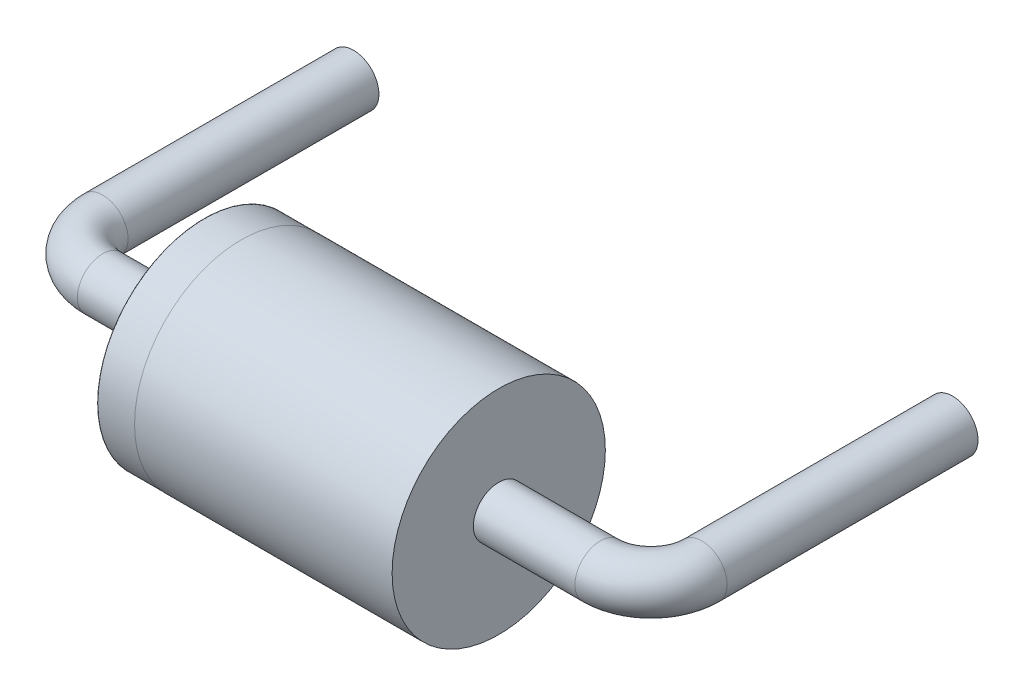
ISO-10303-21;
HEADER;
FILE_DESCRIPTION(('STEP AP214'),'2;1');
FILE_NAME('part.step','',(''),(''),'','','');
FILE_SCHEMA(('AUTOMOTIVE_DESIGN { 1 0 10303 214 1 1 1 1 }'));
ENDSEC;
DATA;
#1=APPLICATION_CONTEXT('core data for automotive mechanical design processes');
#2=APPLICATION_PROTOCOL_DEFINITION('international standard','automotive_design',2000,#1);
#3=PRODUCT_CONTEXT('',#1,'mechanical');
#4=PRODUCT('Part','Part','',(#3));
#5=PRODUCT_RELATED_PRODUCT_CATEGORY('part','',(#4));
#6=PRODUCT_DEFINITION_FORMATION('','',#4);
#7=PRODUCT_DEFINITION_CONTEXT('part definition',#1,'design');
#8=PRODUCT_DEFINITION('design','',#6,#7);
#9=PRODUCT_DEFINITION_SHAPE('','',#8);
#10=(LENGTH_UNIT() NAMED_UNIT(*) SI_UNIT(.MILLI.,.METRE.));
#11=(NAMED_UNIT(*) PLANE_ANGLE_UNIT() SI_UNIT($,.RADIAN.));
#12=(NAMED_UNIT(*) SI_UNIT($,.STERADIAN.) SOLID_ANGLE_UNIT());
#13=UNCERTAINTY_MEASURE_WITH_UNIT(LENGTH_MEASURE(1.E-05),#10,'distance_accuracy_value','');
#14=(GEOMETRIC_REPRESENTATION_CONTEXT(3) GLOBAL_UNCERTAINTY_ASSIGNED_CONTEXT((#13)) GLOBAL_UNIT_ASSIGNED_CONTEXT((#10,
#11,#12)) REPRESENTATION_CONTEXT('',''));
#15=CARTESIAN_POINT('',(0.,0.,0.));
#16=DIRECTION('',(0.,0.,1.));
#17=DIRECTION('',(1.,0.,0.));
#18=AXIS2_PLACEMENT_3D('',#15,#16,#17);
#19=CARTESIAN_POINT('',(-1.449,0.,1.05));
#20=DIRECTION('',(1.,0.,0.));
#21=DIRECTION('',(0.,0.,1.));
#22=AXIS2_PLACEMENT_3D('',#19,#20,#21);
#23=PLANE('',#22);
#24=CARTESIAN_POINT('',(-1.449,0.,1.05));
#25=DIRECTION('',(-1.,0.,0.));
#26=DIRECTION('',(0.,0.,-1.));
#27=AXIS2_PLACEMENT_3D('',#24,#25,#26);
#28=CIRCLE('',#27,1.04895);
#29=CARTESIAN_POINT('',(-1.449,0.,2.09895));
#30=VERTEX_POINT('',#29);
#31=EDGE_CURVE('E199',#30,#30,#28,.T.);
#32=ORIENTED_EDGE('',*,*,#31,.T.);
#33=EDGE_LOOP('',(#32));
#34=FACE_BOUND('',#33,.T.);
#35=CARTESIAN_POINT('',(-1.449,0.,1.05));
#36=DIRECTION('',(1.,0.,0.));
#37=DIRECTION('',(0.,0.,-1.));
#38=AXIS2_PLACEMENT_3D('',#35,#36,#37);
#39=CIRCLE('',#38,1.05);
#40=CARTESIAN_POINT('',(-1.449,0.,2.1));
#41=VERTEX_POINT('',#40);
#42=EDGE_CURVE('E175',#41,#41,#39,.T.);
#43=ORIENTED_EDGE('',*,*,#42,.T.);
#44=EDGE_LOOP('',(#43));
#45=FACE_BOUND('',#44,.T.);
#46=ADVANCED_FACE('F17',(#34,#45),#23,.T.);
#47=CARTESIAN_POINT('',(-1.45,0.,1.05));
#48=DIRECTION('',(-1.,0.,0.));
#49=DIRECTION('',(0.,0.,1.));
#50=AXIS2_PLACEMENT_3D('',#47,#48,#49);
#51=PLANE('',#50);
#52=CARTESIAN_POINT('',(-1.45,0.,1.05));
#53=DIRECTION('',(1.,0.,0.));
#54=DIRECTION('',(0.,0.,-1.));
#55=AXIS2_PLACEMENT_3D('',#52,#53,#54);
#56=CIRCLE('',#55,0.25);
#57=CARTESIAN_POINT('',(-1.45,0.,1.3));
#58=VERTEX_POINT('',#57);
#59=EDGE_CURVE('E135',#58,#58,#56,.T.);
#60=ORIENTED_EDGE('',*,*,#59,.T.);
#61=EDGE_LOOP('',(#60));
#62=FACE_BOUND('',#61,.T.);
#63=CARTESIAN_POINT('',(-1.45,0.,1.05));
#64=DIRECTION('',(-1.,0.,0.));
#65=DIRECTION('',(0.,0.,-1.));
#66=AXIS2_PLACEMENT_3D('',#63,#64,#65);
#67=CIRCLE('',#66,1.05);
#68=CARTESIAN_POINT('',(-1.45,0.,2.1));
#69=VERTEX_POINT('',#68);
#70=EDGE_CURVE('E11',#69,#69,#67,.T.);
#71=ORIENTED_EDGE('',*,*,#70,.T.);
#72=EDGE_LOOP('',(#71));
#73=FACE_BOUND('',#72,.T.);
#74=ADVANCED_FACE('F212',(#62,#73),#51,.T.);
#75=CARTESIAN_POINT('',(-1.4495,0.,1.05));
#76=DIRECTION('',(1.,0.,0.));
#77=DIRECTION('',(0.,0.,-1.));
#78=AXIS2_PLACEMENT_3D('',#75,#76,#77);
#79=CYLINDRICAL_SURFACE('',#78,1.05);
#80=ORIENTED_EDGE('',*,*,#42,.F.);
#81=DIRECTION('',(-1.,0.,0.));
#82=VECTOR('',#81,1.);
#83=CARTESIAN_POINT('',(-1.4495,0.,2.1));
#84=LINE('',#83,#82);
#85=EDGE_CURVE('E28',#41,#69,#84,.T.);
#86=ORIENTED_EDGE('',*,*,#85,.T.);
#87=ORIENTED_EDGE('',*,*,#70,.F.);
#88=ORIENTED_EDGE('',*,*,#85,.F.);
#89=EDGE_LOOP('',(#80,#86,#87,#88));
#90=FACE_BOUND('',#89,.T.);
#91=ADVANCED_FACE('F209',(#90),#79,.T.);
#92=CARTESIAN_POINT('',(-1.26775,0.,1.05));
#93=DIRECTION('',(1.,0.,0.));
#94=DIRECTION('',(0.,0.,-1.));
#95=AXIS2_PLACEMENT_3D('',#92,#93,#94);
#96=CYLINDRICAL_SURFACE('',#95,1.04895);
#97=CARTESIAN_POINT('',(-1.0865,0.,1.05));
#98=DIRECTION('',(1.,0.,0.));
#99=DIRECTION('',(0.,0.,-1.));
#100=AXIS2_PLACEMENT_3D('',#97,#98,#99);
#101=CIRCLE('',#100,1.04895);
#102=CARTESIAN_POINT('',(-1.0865,0.,2.09895));
#103=VERTEX_POINT('',#102);
#104=EDGE_CURVE('E115',#103,#103,#101,.T.);
#105=ORIENTED_EDGE('',*,*,#104,.F.);
#106=DIRECTION('',(-1.,0.,0.));
#107=VECTOR('',#106,1.);
#108=CARTESIAN_POINT('',(-1.26775,0.,2.09895));
#109=LINE('',#108,#107);
#110=EDGE_CURVE('E110',#103,#30,#109,.T.);
#111=ORIENTED_EDGE('',*,*,#110,.T.);
#112=ORIENTED_EDGE('',*,*,#31,.F.);
#113=ORIENTED_EDGE('',*,*,#110,.F.);
#114=EDGE_LOOP('',(#105,#111,#112,#113));
#115=FACE_BOUND('',#114,.T.);
#116=ADVANCED_FACE('F211',(#115),#96,.T.);
#117=CARTESIAN_POINT('',(1.45,0.,1.05));
#118=DIRECTION('',(1.,0.,0.));
#119=DIRECTION('',(0.,0.,1.));
#120=AXIS2_PLACEMENT_3D('',#117,#118,#119);
#121=PLANE('',#120);
#122=CARTESIAN_POINT('',(1.45,0.,1.05));
#123=DIRECTION('',(-1.,0.,0.));
#124=DIRECTION('',(0.,0.,-1.));
#125=AXIS2_PLACEMENT_3D('',#122,#123,#124);
#126=CIRCLE('',#125,0.25);
#127=CARTESIAN_POINT('',(1.45,0.,1.3));
#128=VERTEX_POINT('',#127);
#129=EDGE_CURVE('E131',#128,#128,#126,.T.);
#130=ORIENTED_EDGE('',*,*,#129,.T.);
#131=EDGE_LOOP('',(#130));
#132=FACE_BOUND('',#131,.T.);
#133=CARTESIAN_POINT('',(1.45,0.,1.05));
#134=DIRECTION('',(1.,0.,0.));
#135=DIRECTION('',(0.,0.,-1.));
#136=AXIS2_PLACEMENT_3D('',#133,#134,#135);
#137=CIRCLE('',#136,1.05);
#138=CARTESIAN_POINT('',(1.45,0.,2.1));
#139=VERTEX_POINT('',#138);
#140=EDGE_CURVE('E106',#139,#139,#137,.T.);
#141=ORIENTED_EDGE('',*,*,#140,.T.);
#142=EDGE_LOOP('',(#141));
#143=FACE_BOUND('',#142,.T.);
#144=ADVANCED_FACE('F113',(#132,#143),#121,.T.);
#145=CARTESIAN_POINT('',(0.18175,0.,1.05));
#146=DIRECTION('',(1.,0.,0.));
#147=DIRECTION('',(0.,0.,-1.));
#148=AXIS2_PLACEMENT_3D('',#145,#146,#147);
#149=CYLINDRICAL_SURFACE('',#148,1.05);
#150=ORIENTED_EDGE('',*,*,#140,.F.);
#151=DIRECTION('',(-1.,0.,0.));
#152=VECTOR('',#151,1.);
#153=CARTESIAN_POINT('',(0.18175,0.,2.1));
#154=LINE('',#153,#152);
#155=CARTESIAN_POINT('',(-1.0865,0.,2.1));
#156=VERTEX_POINT('',#155);
#157=EDGE_CURVE('E103',#139,#156,#154,.T.);
#158=ORIENTED_EDGE('',*,*,#157,.T.);
#159=CARTESIAN_POINT('',(-1.0865,0.,1.05));
#160=DIRECTION('',(-1.,0.,0.));
#161=DIRECTION('',(0.,0.,-1.));
#162=AXIS2_PLACEMENT_3D('',#159,#160,#161);
#163=CIRCLE('',#162,1.05);
#164=EDGE_CURVE('E108',#156,#156,#163,.T.);
#165=ORIENTED_EDGE('',*,*,#164,.F.);
#166=ORIENTED_EDGE('',*,*,#157,.F.);
#167=EDGE_LOOP('',(#150,#158,#165,#166));
#168=FACE_BOUND('',#167,.T.);
#169=ADVANCED_FACE('F105',(#168),#149,.T.);
#170=CARTESIAN_POINT('',(-1.0865,0.,1.05));
#171=DIRECTION('',(-1.,0.,0.));
#172=DIRECTION('',(0.,0.,1.));
#173=AXIS2_PLACEMENT_3D('',#170,#171,#172);
#174=PLANE('',#173);
#175=ORIENTED_EDGE('',*,*,#104,.T.);
#176=EDGE_LOOP('',(#175));
#177=FACE_BOUND('',#176,.T.);
#178=ORIENTED_EDGE('',*,*,#164,.T.);
#179=EDGE_LOOP('',(#178));
#180=FACE_BOUND('',#179,.T.);
#181=ADVANCED_FACE('F233',(#177,#180),#174,.T.);
#182=CARTESIAN_POINT('',(-1.95,0.,1.05));
#183=DIRECTION('',(1.,0.,0.));
#184=DIRECTION('',(0.,0.,-1.));
#185=AXIS2_PLACEMENT_3D('',#182,#183,#184);
#186=CYLINDRICAL_SURFACE('',#185,0.25);
#187=ORIENTED_EDGE('',*,*,#59,.F.);
#188=DIRECTION('',(-1.,0.,0.));
#189=VECTOR('',#188,1.);
#190=CARTESIAN_POINT('',(-1.95,0.,1.3));
#191=LINE('',#190,#189);
#192=CARTESIAN_POINT('',(-2.45,0.,1.3));
#193=VERTEX_POINT('',#192);
#194=EDGE_CURVE('E125',#58,#193,#191,.T.);
#195=ORIENTED_EDGE('',*,*,#194,.T.);
#196=CARTESIAN_POINT('',(-2.45,0.,1.05));
#197=DIRECTION('',(1.,0.,0.));
#198=DIRECTION('',(0.,0.,-1.));
#199=AXIS2_PLACEMENT_3D('',#196,#197,#198);
#200=CIRCLE('',#199,0.25);
#201=CARTESIAN_POINT('',(-2.45,0.,0.8));
#202=VERTEX_POINT('',#201);
#203=EDGE_CURVE('E142',#193,#202,#200,.T.);
#204=ORIENTED_EDGE('',*,*,#203,.T.);
#205=CARTESIAN_POINT('',(-2.45,0.,1.05));
#206=DIRECTION('',(1.,0.,0.));
#207=DIRECTION('',(0.,0.,-1.));
#208=AXIS2_PLACEMENT_3D('',#205,#206,#207);
#209=CIRCLE('',#208,0.25);
#210=EDGE_CURVE('E136',#202,#193,#209,.T.);
#211=ORIENTED_EDGE('',*,*,#210,.T.);
#212=ORIENTED_EDGE('',*,*,#194,.F.);
#213=EDGE_LOOP('',(#187,#195,#204,#211,#212));
#214=FACE_BOUND('',#213,.T.);
#215=ADVANCED_FACE('F230',(#214),#186,.T.);
#216=CARTESIAN_POINT('',(-2.45,0.,0.55));
#217=DIRECTION('',(0.,1.,0.));
#218=DIRECTION('',(-1.,0.,0.));
#219=AXIS2_PLACEMENT_3D('',#216,#217,#218);
#220=TOROIDAL_SURFACE('',#219,0.5,0.25);
#221=ORIENTED_EDGE('',*,*,#203,.F.);
#222=ORIENTED_EDGE('',*,*,#210,.F.);
#223=CARTESIAN_POINT('',(-2.45,0.,0.55));
#224=DIRECTION('',(0.,-1.,0.));
#225=DIRECTION('',(-1.,0.,0.));
#226=AXIS2_PLACEMENT_3D('',#223,#224,#225);
#227=CIRCLE('',#226,0.25);
#228=CARTESIAN_POINT('',(-2.7,0.,0.55));
#229=VERTEX_POINT('',#228);
#230=EDGE_CURVE('E132',#202,#229,#227,.T.);
#231=ORIENTED_EDGE('',*,*,#230,.T.);
#232=CARTESIAN_POINT('',(-2.95,0.,0.55));
#233=DIRECTION('',(0.,0.,1.));
#234=DIRECTION('',(1.,0.,0.));
#235=AXIS2_PLACEMENT_3D('',#232,#233,#234);
#236=CIRCLE('',#235,0.25);
#237=CARTESIAN_POINT('',(-3.2,0.,0.55));
#238=VERTEX_POINT('',#237);
#239=EDGE_CURVE('E127',#229,#238,#236,.T.);
#240=ORIENTED_EDGE('',*,*,#239,.T.);
#241=CARTESIAN_POINT('',(-2.95,0.,0.55));
#242=DIRECTION('',(0.,0.,1.));
#243=DIRECTION('',(1.,0.,0.));
#244=AXIS2_PLACEMENT_3D('',#241,#242,#243);
#245=CIRCLE('',#244,0.25);
#246=EDGE_CURVE('E130',#238,#229,#245,.T.);
#247=ORIENTED_EDGE('',*,*,#246,.T.);
#248=ORIENTED_EDGE('',*,*,#230,.F.);
#249=EDGE_LOOP('',(#221,#222,#231,#240,#247,#248));
#250=FACE_BOUND('',#249,.T.);
#251=ADVANCED_FACE('F232',(#250),#220,.T.);
#252=CARTESIAN_POINT('',(-2.95,0.,-1.92));
#253=DIRECTION('',(0.,0.,1.));
#254=DIRECTION('',(1.,0.,0.));
#255=AXIS2_PLACEMENT_3D('',#252,#253,#254);
#256=PLANE('',#255);
#257=CARTESIAN_POINT('',(-2.95,0.,-1.92));
#258=DIRECTION('',(0.,0.,1.));
#259=DIRECTION('',(1.,0.,0.));
#260=AXIS2_PLACEMENT_3D('',#257,#258,#259);
#261=CIRCLE('',#260,0.25);
#262=CARTESIAN_POINT('',(-3.2,0.,-1.92));
#263=VERTEX_POINT('',#262);
#264=EDGE_CURVE('E145',#263,#263,#261,.T.);
#265=ORIENTED_EDGE('',*,*,#264,.F.);
#266=EDGE_LOOP('',(#265));
#267=FACE_BOUND('',#266,.T.);
#268=ADVANCED_FACE('F238',(#267),#256,.F.);
#269=CARTESIAN_POINT('',(-2.95,0.,-0.685));
#270=DIRECTION('',(0.,0.,1.));
#271=DIRECTION('',(1.,0.,0.));
#272=AXIS2_PLACEMENT_3D('',#269,#270,#271);
#273=CYLINDRICAL_SURFACE('',#272,0.25);
#274=ORIENTED_EDGE('',*,*,#239,.F.);
#275=ORIENTED_EDGE('',*,*,#246,.F.);
#276=DIRECTION('',(0.,0.,-1.));
#277=VECTOR('',#276,1.);
#278=CARTESIAN_POINT('',(-3.2,0.,-0.685));
#279=LINE('',#278,#277);
#280=EDGE_CURVE('E154',#238,#263,#279,.T.);
#281=ORIENTED_EDGE('',*,*,#280,.T.);
#282=ORIENTED_EDGE('',*,*,#264,.T.);
#283=ORIENTED_EDGE('',*,*,#280,.F.);
#284=EDGE_LOOP('',(#274,#275,#281,#282,#283));
#285=FACE_BOUND('',#284,.T.);
#286=ADVANCED_FACE('F250',(#285),#273,.T.);
#287=CARTESIAN_POINT('',(1.95,0.,1.05));
#288=DIRECTION('',(1.,0.,0.));
#289=DIRECTION('',(0.,0.,-1.));
#290=AXIS2_PLACEMENT_3D('',#287,#288,#289);
#291=CYLINDRICAL_SURFACE('',#290,0.25);
#292=CARTESIAN_POINT('',(2.45,0.,1.05));
#293=DIRECTION('',(1.,0.,0.));
#294=DIRECTION('',(0.,0.,-1.));
#295=AXIS2_PLACEMENT_3D('',#292,#293,#294);
#296=CIRCLE('',#295,0.25);
#297=CARTESIAN_POINT('',(2.45,0.,1.3));
#298=VERTEX_POINT('',#297);
#299=CARTESIAN_POINT('',(2.45,0.,0.8));
#300=VERTEX_POINT('',#299);
#301=EDGE_CURVE('E21',#298,#300,#296,.T.);
#302=ORIENTED_EDGE('',*,*,#301,.F.);
#303=DIRECTION('',(-1.,0.,0.));
#304=VECTOR('',#303,1.);
#305=CARTESIAN_POINT('',(1.95,0.,1.3));
#306=LINE('',#305,#304);
#307=EDGE_CURVE('E138',#298,#128,#306,.T.);
#308=ORIENTED_EDGE('',*,*,#307,.T.);
#309=ORIENTED_EDGE('',*,*,#129,.F.);
#310=ORIENTED_EDGE('',*,*,#307,.F.);
#311=CARTESIAN_POINT('',(2.45,0.,1.05));
#312=DIRECTION('',(1.,0.,0.));
#313=DIRECTION('',(0.,0.,-1.));
#314=AXIS2_PLACEMENT_3D('',#311,#312,#313);
#315=CIRCLE('',#314,0.25);
#316=EDGE_CURVE('E183',#300,#298,#315,.T.);
#317=ORIENTED_EDGE('',*,*,#316,.F.);
#318=EDGE_LOOP('',(#302,#308,#309,#310,#317));
#319=FACE_BOUND('',#318,.T.);
#320=ADVANCED_FACE('F252',(#319),#291,.T.);
#321=CARTESIAN_POINT('',(2.45,0.,0.55));
#322=DIRECTION('',(0.,1.,0.));
#323=DIRECTION('',(1.,0.,0.));
#324=AXIS2_PLACEMENT_3D('',#321,#322,#323);
#325=TOROIDAL_SURFACE('',#324,0.5,0.25);
#326=CARTESIAN_POINT('',(2.95,0.,0.55));
#327=DIRECTION('',(0.,0.,-1.));
#328=DIRECTION('',(-1.,0.,0.));
#329=AXIS2_PLACEMENT_3D('',#326,#327,#328);
#330=CIRCLE('',#329,0.25);
#331=CARTESIAN_POINT('',(2.7,0.,0.55));
#332=VERTEX_POINT('',#331);
#333=CARTESIAN_POINT('',(3.2,0.,0.55));
#334=VERTEX_POINT('',#333);
#335=EDGE_CURVE('E167',#332,#334,#330,.T.);
#336=ORIENTED_EDGE('',*,*,#335,.F.);
#337=CARTESIAN_POINT('',(2.45,0.,0.55));
#338=DIRECTION('',(0.,-1.,0.));
#339=DIRECTION('',(1.,0.,0.));
#340=AXIS2_PLACEMENT_3D('',#337,#338,#339);
#341=CIRCLE('',#340,0.25);
#342=EDGE_CURVE('E171',#332,#300,#341,.T.);
#343=ORIENTED_EDGE('',*,*,#342,.T.);
#344=ORIENTED_EDGE('',*,*,#316,.T.);
#345=ORIENTED_EDGE('',*,*,#301,.T.);
#346=ORIENTED_EDGE('',*,*,#342,.F.);
#347=CARTESIAN_POINT('',(2.95,0.,0.55));
#348=DIRECTION('',(0.,0.,-1.));
#349=DIRECTION('',(-1.,0.,0.));
#350=AXIS2_PLACEMENT_3D('',#347,#348,#349);
#351=CIRCLE('',#350,0.25);
#352=EDGE_CURVE('E164',#334,#332,#351,.T.);
#353=ORIENTED_EDGE('',*,*,#352,.F.);
#354=EDGE_LOOP('',(#336,#343,#344,#345,#346,#353));
#355=FACE_BOUND('',#354,.T.);
#356=ADVANCED_FACE('F257',(#355),#325,.T.);
#357=CARTESIAN_POINT('',(2.95,0.,-1.92));
#358=DIRECTION('',(0.,0.,-1.));
#359=DIRECTION('',(0.,-1.,0.));
#360=AXIS2_PLACEMENT_3D('',#357,#358,#359);
#361=PLANE('',#360);
#362=CARTESIAN_POINT('',(2.95,0.,-1.92));
#363=DIRECTION('',(0.,0.,-1.));
#364=DIRECTION('',(-1.,0.,0.));
#365=AXIS2_PLACEMENT_3D('',#362,#363,#364);
#366=CIRCLE('',#365,0.25);
#367=CARTESIAN_POINT('',(3.2,0.,-1.92));
#368=VERTEX_POINT('',#367);
#369=EDGE_CURVE('E178',#368,#368,#366,.T.);
#370=ORIENTED_EDGE('',*,*,#369,.T.);
#371=EDGE_LOOP('',(#370));
#372=FACE_BOUND('',#371,.T.);
#373=ADVANCED_FACE('F19',(#372),#361,.T.);
#374=CARTESIAN_POINT('',(2.95,0.,-0.685));
#375=DIRECTION('',(0.,0.,-1.));
#376=DIRECTION('',(-1.,0.,0.));
#377=AXIS2_PLACEMENT_3D('',#374,#375,#376);
#378=CYLINDRICAL_SURFACE('',#377,0.25);
#379=ORIENTED_EDGE('',*,*,#369,.F.);
#380=DIRECTION('',(0.,0.,1.));
#381=VECTOR('',#380,1.);
#382=CARTESIAN_POINT('',(3.2,0.,-0.685));
#383=LINE('',#382,#381);
#384=EDGE_CURVE('E168',#368,#334,#383,.T.);
#385=ORIENTED_EDGE('',*,*,#384,.T.);
#386=ORIENTED_EDGE('',*,*,#352,.T.);
#387=ORIENTED_EDGE('',*,*,#335,.T.);
#388=ORIENTED_EDGE('',*,*,#384,.F.);
#389=EDGE_LOOP('',(#379,#385,#386,#387,#388));
#390=FACE_BOUND('',#389,.T.);
#391=ADVANCED_FACE('F265',(#390),#378,.T.);
#392=CLOSED_SHELL('',(#46,#74,#91,#116,#144,#169,#181,#215,#251,#268,#286,#320,#356,#373,#391));
#393=MANIFOLD_SOLID_BREP('B1',#392);
#394=ADVANCED_BREP_SHAPE_REPRESENTATION('',(#18,#393),#14);
#395=SHAPE_DEFINITION_REPRESENTATION(#9,#394);
ENDSEC;
END-ISO-10303-21;
